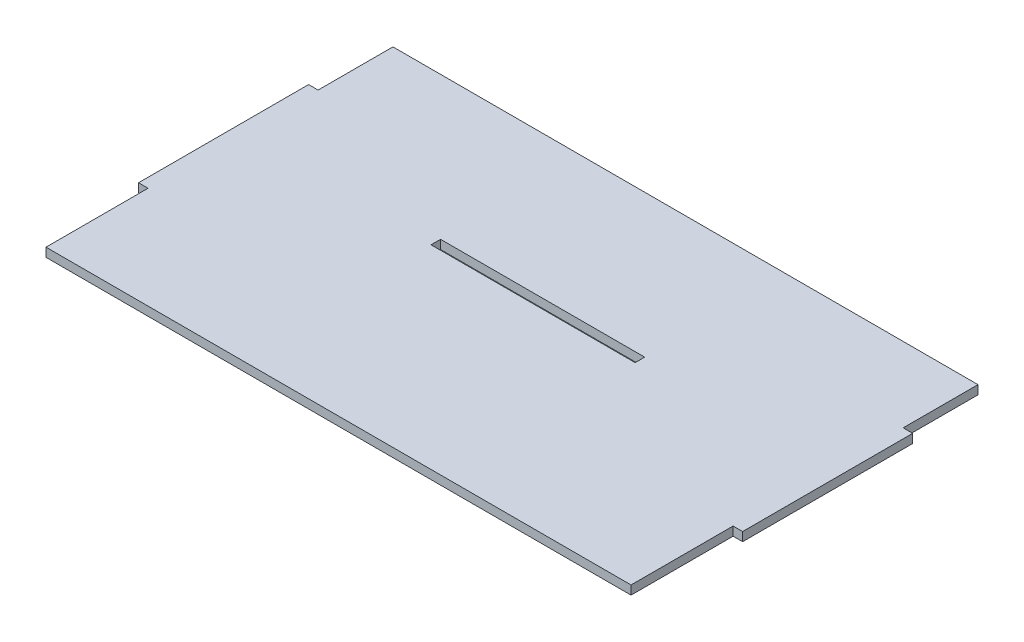
ISO-10303-21;
HEADER;
FILE_DESCRIPTION(('STEP AP214'),'2;1');
FILE_NAME('part.step','',(''),(''),'','','');
FILE_SCHEMA(('AUTOMOTIVE_DESIGN { 1 0 10303 214 1 1 1 1 }'));
ENDSEC;
DATA;
#1=APPLICATION_CONTEXT('core data for automotive mechanical design processes');
#2=APPLICATION_PROTOCOL_DEFINITION('international standard','automotive_design',2000,#1);
#3=PRODUCT_CONTEXT('',#1,'mechanical');
#4=PRODUCT('Part','Part','',(#3));
#5=PRODUCT_RELATED_PRODUCT_CATEGORY('part','',(#4));
#6=PRODUCT_DEFINITION_FORMATION('','',#4);
#7=PRODUCT_DEFINITION_CONTEXT('part definition',#1,'design');
#8=PRODUCT_DEFINITION('design','',#6,#7);
#9=PRODUCT_DEFINITION_SHAPE('','',#8);
#10=(LENGTH_UNIT() NAMED_UNIT(*) SI_UNIT(.MILLI.,.METRE.));
#11=(NAMED_UNIT(*) PLANE_ANGLE_UNIT() SI_UNIT($,.RADIAN.));
#12=(NAMED_UNIT(*) SI_UNIT($,.STERADIAN.) SOLID_ANGLE_UNIT());
#13=UNCERTAINTY_MEASURE_WITH_UNIT(LENGTH_MEASURE(1.E-05),#10,'distance_accuracy_value','');
#14=(GEOMETRIC_REPRESENTATION_CONTEXT(3) GLOBAL_UNCERTAINTY_ASSIGNED_CONTEXT((#13)) GLOBAL_UNIT_ASSIGNED_CONTEXT((#10,
#11,#12)) REPRESENTATION_CONTEXT('',''));
#15=CARTESIAN_POINT('',(0.,0.,0.));
#16=DIRECTION('',(0.,0.,1.));
#17=DIRECTION('',(1.,0.,0.));
#18=AXIS2_PLACEMENT_3D('',#15,#16,#17);
#19=CARTESIAN_POINT('',(43.,1.3,-25.));
#20=DIRECTION('',(-1.,0.,0.));
#21=DIRECTION('',(0.,0.,1.));
#22=AXIS2_PLACEMENT_3D('',#19,#20,#21);
#23=PLANE('',#22);
#24=DIRECTION('',(0.,1.,0.));
#25=VECTOR('',#24,1.);
#26=CARTESIAN_POINT('',(43.,0.,-15.));
#27=LINE('',#26,#25);
#28=CARTESIAN_POINT('',(43.,0.,-15.));
#29=VERTEX_POINT('',#28);
#30=CARTESIAN_POINT('',(43.,1.3,-15.));
#31=VERTEX_POINT('',#30);
#32=EDGE_CURVE('E227',#29,#31,#27,.T.);
#33=ORIENTED_EDGE('',*,*,#32,.F.);
#34=DIRECTION('',(0.,0.,-1.));
#35=VECTOR('',#34,1.);
#36=CARTESIAN_POINT('',(43.,0.,-25.));
#37=LINE('',#36,#35);
#38=CARTESIAN_POINT('',(43.,0.,-26.));
#39=VERTEX_POINT('',#38);
#40=EDGE_CURVE('E178',#29,#39,#37,.T.);
#41=ORIENTED_EDGE('',*,*,#40,.T.);
#42=DIRECTION('',(0.,-1.,0.));
#43=VECTOR('',#42,1.);
#44=CARTESIAN_POINT('',(43.,1.3,-26.));
#45=LINE('',#44,#43);
#46=CARTESIAN_POINT('',(43.,1.3,-26.));
#47=VERTEX_POINT('',#46);
#48=EDGE_CURVE('E176',#47,#39,#45,.T.);
#49=ORIENTED_EDGE('',*,*,#48,.F.);
#50=DIRECTION('',(0.,0.,-1.));
#51=VECTOR('',#50,1.);
#52=CARTESIAN_POINT('',(43.,1.3,-25.));
#53=LINE('',#52,#51);
#54=EDGE_CURVE('E158',#31,#47,#53,.T.);
#55=ORIENTED_EDGE('',*,*,#54,.F.);
#56=EDGE_LOOP('',(#33,#41,#49,#55));
#57=FACE_BOUND('',#56,.T.);
#58=ADVANCED_FACE('F43',(#57),#23,.F.);
#59=CARTESIAN_POINT('',(-43.,1.3,-25.));
#60=DIRECTION('',(1.,0.,0.));
#61=DIRECTION('',(0.,0.,-1.));
#62=AXIS2_PLACEMENT_3D('',#59,#60,#61);
#63=PLANE('',#62);
#64=DIRECTION('',(0.,1.,0.));
#65=VECTOR('',#64,1.);
#66=CARTESIAN_POINT('',(-43.,0.,9.99999999999999));
#67=LINE('',#66,#65);
#68=CARTESIAN_POINT('',(-43.,0.,9.99999999999999));
#69=VERTEX_POINT('',#68);
#70=CARTESIAN_POINT('',(-43.,1.3,9.99999999999999));
#71=VERTEX_POINT('',#70);
#72=EDGE_CURVE('E292',#69,#71,#67,.T.);
#73=ORIENTED_EDGE('',*,*,#72,.F.);
#74=DIRECTION('',(0.,0.,1.));
#75=VECTOR('',#74,1.);
#76=CARTESIAN_POINT('',(-43.,0.,-25.));
#77=LINE('',#76,#75);
#78=CARTESIAN_POINT('',(-43.,0.,25.));
#79=VERTEX_POINT('',#78);
#80=EDGE_CURVE('E316',#69,#79,#77,.T.);
#81=ORIENTED_EDGE('',*,*,#80,.T.);
#82=DIRECTION('',(0.,-1.,0.));
#83=VECTOR('',#82,1.);
#84=CARTESIAN_POINT('',(-43.,1.3,25.));
#85=LINE('',#84,#83);
#86=CARTESIAN_POINT('',(-43.,1.3,25.));
#87=VERTEX_POINT('',#86);
#88=EDGE_CURVE('E11',#87,#79,#85,.T.);
#89=ORIENTED_EDGE('',*,*,#88,.F.);
#90=DIRECTION('',(0.,0.,1.));
#91=VECTOR('',#90,1.);
#92=CARTESIAN_POINT('',(-43.,1.3,-25.));
#93=LINE('',#92,#91);
#94=EDGE_CURVE('E305',#71,#87,#93,.T.);
#95=ORIENTED_EDGE('',*,*,#94,.F.);
#96=EDGE_LOOP('',(#73,#81,#89,#95));
#97=FACE_BOUND('',#96,.T.);
#98=ADVANCED_FACE('F345',(#97),#63,.F.);
#99=CARTESIAN_POINT('',(43.,0.,25.));
#100=VERTEX_POINT('',#99);
#101=CARTESIAN_POINT('',(43.,0.,9.99999999999999));
#102=VERTEX_POINT('',#101);
#103=EDGE_CURVE('E312',#100,#102,#37,.T.);
#104=ORIENTED_EDGE('',*,*,#103,.T.);
#105=DIRECTION('',(0.,1.,0.));
#106=VECTOR('',#105,1.);
#107=CARTESIAN_POINT('',(43.,0.,9.99999999999999));
#108=LINE('',#107,#106);
#109=CARTESIAN_POINT('',(43.,1.3,9.99999999999998));
#110=VERTEX_POINT('',#109);
#111=EDGE_CURVE('E236',#102,#110,#108,.T.);
#112=ORIENTED_EDGE('',*,*,#111,.T.);
#113=CARTESIAN_POINT('',(43.,1.3,25.));
#114=VERTEX_POINT('',#113);
#115=EDGE_CURVE('E172',#114,#110,#53,.T.);
#116=ORIENTED_EDGE('',*,*,#115,.F.);
#117=DIRECTION('',(0.,-1.,0.));
#118=VECTOR('',#117,1.);
#119=CARTESIAN_POINT('',(43.,1.3,25.));
#120=LINE('',#119,#118);
#121=EDGE_CURVE('E52',#114,#100,#120,.T.);
#122=ORIENTED_EDGE('',*,*,#121,.T.);
#123=EDGE_LOOP('',(#104,#112,#116,#122));
#124=FACE_BOUND('',#123,.T.);
#125=ADVANCED_FACE('F45',(#124),#23,.F.);
#126=CARTESIAN_POINT('',(-43.,0.,-26.));
#127=VERTEX_POINT('',#126);
#128=CARTESIAN_POINT('',(-43.,0.,-15.));
#129=VERTEX_POINT('',#128);
#130=EDGE_CURVE('E317',#127,#129,#77,.T.);
#131=ORIENTED_EDGE('',*,*,#130,.T.);
#132=DIRECTION('',(0.,1.,0.));
#133=VECTOR('',#132,1.);
#134=CARTESIAN_POINT('',(-43.,0.,-15.));
#135=LINE('',#134,#133);
#136=CARTESIAN_POINT('',(-43.,1.3,-15.));
#137=VERTEX_POINT('',#136);
#138=EDGE_CURVE('E281',#129,#137,#135,.T.);
#139=ORIENTED_EDGE('',*,*,#138,.T.);
#140=CARTESIAN_POINT('',(-43.,1.3,-26.));
#141=VERTEX_POINT('',#140);
#142=EDGE_CURVE('E306',#141,#137,#93,.T.);
#143=ORIENTED_EDGE('',*,*,#142,.F.);
#144=DIRECTION('',(0.,-1.,0.));
#145=VECTOR('',#144,1.);
#146=CARTESIAN_POINT('',(-43.,1.3,-26.));
#147=LINE('',#146,#145);
#148=EDGE_CURVE('E183',#141,#127,#147,.T.);
#149=ORIENTED_EDGE('',*,*,#148,.T.);
#150=EDGE_LOOP('',(#131,#139,#143,#149));
#151=FACE_BOUND('',#150,.T.);
#152=ADVANCED_FACE('F361',(#151),#63,.F.);
#153=CARTESIAN_POINT('',(-43.,1.3,25.));
#154=DIRECTION('',(0.,0.,-1.));
#155=DIRECTION('',(-1.,0.,0.));
#156=AXIS2_PLACEMENT_3D('',#153,#154,#155);
#157=PLANE('',#156);
#158=DIRECTION('',(1.,0.,0.));
#159=VECTOR('',#158,1.);
#160=CARTESIAN_POINT('',(-43.,0.,25.));
#161=LINE('',#160,#159);
#162=EDGE_CURVE('E173',#79,#100,#161,.T.);
#163=ORIENTED_EDGE('',*,*,#162,.T.);
#164=ORIENTED_EDGE('',*,*,#121,.F.);
#165=DIRECTION('',(1.,0.,0.));
#166=VECTOR('',#165,1.);
#167=CARTESIAN_POINT('',(-43.,1.3,25.));
#168=LINE('',#167,#166);
#169=EDGE_CURVE('E309',#87,#114,#168,.T.);
#170=ORIENTED_EDGE('',*,*,#169,.F.);
#171=ORIENTED_EDGE('',*,*,#88,.T.);
#172=EDGE_LOOP('',(#163,#164,#170,#171));
#173=FACE_BOUND('',#172,.T.);
#174=ADVANCED_FACE('F342',(#173),#157,.F.);
#175=CARTESIAN_POINT('',(0.,1.3,0.));
#176=DIRECTION('',(0.,1.,0.));
#177=DIRECTION('',(0.,0.,1.));
#178=AXIS2_PLACEMENT_3D('',#175,#176,#177);
#179=PLANE('',#178);
#180=DIRECTION('',(0.,0.,-1.));
#181=VECTOR('',#180,1.);
#182=CARTESIAN_POINT('',(15.,1.3,-5.00000000000001));
#183=LINE('',#182,#181);
#184=CARTESIAN_POINT('',(15.,1.3,-3.60000000000001));
#185=VERTEX_POINT('',#184);
#186=CARTESIAN_POINT('',(15.,1.3,-5.00000000000001));
#187=VERTEX_POINT('',#186);
#188=EDGE_CURVE('E59',#185,#187,#183,.T.);
#189=ORIENTED_EDGE('',*,*,#188,.F.);
#190=DIRECTION('',(1.,0.,0.));
#191=VECTOR('',#190,1.);
#192=CARTESIAN_POINT('',(-15.,1.3,-3.60000000000001));
#193=LINE('',#192,#191);
#194=CARTESIAN_POINT('',(-15.,1.3,-3.60000000000001));
#195=VERTEX_POINT('',#194);
#196=EDGE_CURVE('E200',#195,#185,#193,.T.);
#197=ORIENTED_EDGE('',*,*,#196,.F.);
#198=DIRECTION('',(0.,0.,1.));
#199=VECTOR('',#198,1.);
#200=CARTESIAN_POINT('',(-15.,1.3,-5.00000000000001));
#201=LINE('',#200,#199);
#202=CARTESIAN_POINT('',(-15.,1.3,-5.00000000000001));
#203=VERTEX_POINT('',#202);
#204=EDGE_CURVE('E217',#203,#195,#201,.T.);
#205=ORIENTED_EDGE('',*,*,#204,.F.);
#206=DIRECTION('',(-1.,0.,0.));
#207=VECTOR('',#206,1.);
#208=CARTESIAN_POINT('',(-15.,1.3,-5.00000000000001));
#209=LINE('',#208,#207);
#210=EDGE_CURVE('E213',#187,#203,#209,.T.);
#211=ORIENTED_EDGE('',*,*,#210,.F.);
#212=EDGE_LOOP('',(#189,#197,#205,#211));
#213=FACE_BOUND('',#212,.T.);
#214=ORIENTED_EDGE('',*,*,#115,.T.);
#215=DIRECTION('',(1.,0.,0.));
#216=VECTOR('',#215,1.);
#217=CARTESIAN_POINT('',(43.,1.3,9.99999999999999));
#218=LINE('',#217,#216);
#219=CARTESIAN_POINT('',(44.4,1.3,9.99999999999999));
#220=VERTEX_POINT('',#219);
#221=EDGE_CURVE('E255',#110,#220,#218,.T.);
#222=ORIENTED_EDGE('',*,*,#221,.T.);
#223=DIRECTION('',(0.,0.,-1.));
#224=VECTOR('',#223,1.);
#225=CARTESIAN_POINT('',(44.4,1.3,-15.));
#226=LINE('',#225,#224);
#227=CARTESIAN_POINT('',(44.4,1.3,-15.));
#228=VERTEX_POINT('',#227);
#229=EDGE_CURVE('E251',#220,#228,#226,.T.);
#230=ORIENTED_EDGE('',*,*,#229,.T.);
#231=DIRECTION('',(-1.,0.,0.));
#232=VECTOR('',#231,1.);
#233=CARTESIAN_POINT('',(43.,1.3,-15.));
#234=LINE('',#233,#232);
#235=EDGE_CURVE('E168',#228,#31,#234,.T.);
#236=ORIENTED_EDGE('',*,*,#235,.T.);
#237=ORIENTED_EDGE('',*,*,#54,.T.);
#238=DIRECTION('',(-1.,0.,0.));
#239=VECTOR('',#238,1.);
#240=CARTESIAN_POINT('',(-43.,1.3,-26.));
#241=LINE('',#240,#239);
#242=EDGE_CURVE('E164',#47,#141,#241,.T.);
#243=ORIENTED_EDGE('',*,*,#242,.T.);
#244=ORIENTED_EDGE('',*,*,#142,.T.);
#245=DIRECTION('',(-1.,0.,0.));
#246=VECTOR('',#245,1.);
#247=CARTESIAN_POINT('',(-43.,1.3,-15.));
#248=LINE('',#247,#246);
#249=CARTESIAN_POINT('',(-44.4,1.3,-15.));
#250=VERTEX_POINT('',#249);
#251=EDGE_CURVE('E259',#137,#250,#248,.T.);
#252=ORIENTED_EDGE('',*,*,#251,.T.);
#253=DIRECTION('',(0.,0.,1.));
#254=VECTOR('',#253,1.);
#255=CARTESIAN_POINT('',(-44.4,1.3,-15.));
#256=LINE('',#255,#254);
#257=CARTESIAN_POINT('',(-44.4,1.3,9.99999999999999));
#258=VERTEX_POINT('',#257);
#259=EDGE_CURVE('E285',#250,#258,#256,.T.);
#260=ORIENTED_EDGE('',*,*,#259,.T.);
#261=DIRECTION('',(1.,0.,0.));
#262=VECTOR('',#261,1.);
#263=CARTESIAN_POINT('',(-43.,1.3,9.99999999999999));
#264=LINE('',#263,#262);
#265=EDGE_CURVE('E274',#258,#71,#264,.T.);
#266=ORIENTED_EDGE('',*,*,#265,.T.);
#267=ORIENTED_EDGE('',*,*,#94,.T.);
#268=ORIENTED_EDGE('',*,*,#169,.T.);
#269=EDGE_LOOP('',(#214,#222,#230,#236,#237,#243,#244,#252,#260,#266,#267,#268));
#270=FACE_BOUND('',#269,.T.);
#271=ADVANCED_FACE('F161',(#213,#270),#179,.T.);
#272=CARTESIAN_POINT('',(0.,0.,0.));
#273=DIRECTION('',(0.,1.,0.));
#274=DIRECTION('',(0.,0.,1.));
#275=AXIS2_PLACEMENT_3D('',#272,#273,#274);
#276=PLANE('',#275);
#277=DIRECTION('',(1.,0.,0.));
#278=VECTOR('',#277,1.);
#279=CARTESIAN_POINT('',(-15.,0.,-3.60000000000001));
#280=LINE('',#279,#278);
#281=CARTESIAN_POINT('',(-15.,0.,-3.60000000000001));
#282=VERTEX_POINT('',#281);
#283=CARTESIAN_POINT('',(15.,0.,-3.60000000000001));
#284=VERTEX_POINT('',#283);
#285=EDGE_CURVE('E206',#282,#284,#280,.T.);
#286=ORIENTED_EDGE('',*,*,#285,.T.);
#287=DIRECTION('',(0.,0.,-1.));
#288=VECTOR('',#287,1.);
#289=CARTESIAN_POINT('',(15.,0.,-5.00000000000001));
#290=LINE('',#289,#288);
#291=CARTESIAN_POINT('',(15.,0.,-5.00000000000001));
#292=VERTEX_POINT('',#291);
#293=EDGE_CURVE('E195',#284,#292,#290,.T.);
#294=ORIENTED_EDGE('',*,*,#293,.T.);
#295=DIRECTION('',(-1.,0.,0.));
#296=VECTOR('',#295,1.);
#297=CARTESIAN_POINT('',(-15.,0.,-5.00000000000001));
#298=LINE('',#297,#296);
#299=CARTESIAN_POINT('',(-15.,0.,-5.00000000000001));
#300=VERTEX_POINT('',#299);
#301=EDGE_CURVE('E199',#292,#300,#298,.T.);
#302=ORIENTED_EDGE('',*,*,#301,.T.);
#303=DIRECTION('',(0.,0.,1.));
#304=VECTOR('',#303,1.);
#305=CARTESIAN_POINT('',(-15.,0.,-5.00000000000001));
#306=LINE('',#305,#304);
#307=EDGE_CURVE('E67',#300,#282,#306,.T.);
#308=ORIENTED_EDGE('',*,*,#307,.T.);
#309=EDGE_LOOP('',(#286,#294,#302,#308));
#310=FACE_BOUND('',#309,.T.);
#311=ORIENTED_EDGE('',*,*,#103,.F.);
#312=ORIENTED_EDGE('',*,*,#162,.F.);
#313=ORIENTED_EDGE('',*,*,#80,.F.);
#314=DIRECTION('',(1.,0.,0.));
#315=VECTOR('',#314,1.);
#316=CARTESIAN_POINT('',(-43.,0.,9.99999999999999));
#317=LINE('',#316,#315);
#318=CARTESIAN_POINT('',(-44.4,0.,9.99999999999999));
#319=VERTEX_POINT('',#318);
#320=EDGE_CURVE('E278',#319,#69,#317,.T.);
#321=ORIENTED_EDGE('',*,*,#320,.F.);
#322=DIRECTION('',(0.,0.,1.));
#323=VECTOR('',#322,1.);
#324=CARTESIAN_POINT('',(-44.4,0.,-15.));
#325=LINE('',#324,#323);
#326=CARTESIAN_POINT('',(-44.4,0.,-15.));
#327=VERTEX_POINT('',#326);
#328=EDGE_CURVE('E273',#327,#319,#325,.T.);
#329=ORIENTED_EDGE('',*,*,#328,.F.);
#330=DIRECTION('',(-1.,0.,0.));
#331=VECTOR('',#330,1.);
#332=CARTESIAN_POINT('',(-43.,0.,-15.));
#333=LINE('',#332,#331);
#334=EDGE_CURVE('E269',#129,#327,#333,.T.);
#335=ORIENTED_EDGE('',*,*,#334,.F.);
#336=ORIENTED_EDGE('',*,*,#130,.F.);
#337=DIRECTION('',(-1.,0.,0.));
#338=VECTOR('',#337,1.);
#339=CARTESIAN_POINT('',(-43.,0.,-26.));
#340=LINE('',#339,#338);
#341=EDGE_CURVE('E188',#39,#127,#340,.T.);
#342=ORIENTED_EDGE('',*,*,#341,.F.);
#343=ORIENTED_EDGE('',*,*,#40,.F.);
#344=DIRECTION('',(-1.,0.,0.));
#345=VECTOR('',#344,1.);
#346=CARTESIAN_POINT('',(43.,0.,-15.));
#347=LINE('',#346,#345);
#348=CARTESIAN_POINT('',(44.4,0.,-15.));
#349=VERTEX_POINT('',#348);
#350=EDGE_CURVE('E240',#349,#29,#347,.T.);
#351=ORIENTED_EDGE('',*,*,#350,.F.);
#352=DIRECTION('',(0.,0.,-1.));
#353=VECTOR('',#352,1.);
#354=CARTESIAN_POINT('',(44.4,0.,-15.));
#355=LINE('',#354,#353);
#356=CARTESIAN_POINT('',(44.4,0.,9.99999999999999));
#357=VERTEX_POINT('',#356);
#358=EDGE_CURVE('E262',#357,#349,#355,.T.);
#359=ORIENTED_EDGE('',*,*,#358,.F.);
#360=DIRECTION('',(1.,0.,0.));
#361=VECTOR('',#360,1.);
#362=CARTESIAN_POINT('',(43.,0.,9.99999999999999));
#363=LINE('',#362,#361);
#364=EDGE_CURVE('E252',#102,#357,#363,.T.);
#365=ORIENTED_EDGE('',*,*,#364,.F.);
#366=EDGE_LOOP('',(#311,#312,#313,#321,#329,#335,#336,#342,#343,#351,#359,#365));
#367=FACE_BOUND('',#366,.T.);
#368=ADVANCED_FACE('F333',(#310,#367),#276,.F.);
#369=CARTESIAN_POINT('',(-43.,0.,9.99999999999999));
#370=DIRECTION('',(0.,0.,1.));
#371=DIRECTION('',(1.,0.,0.));
#372=AXIS2_PLACEMENT_3D('',#369,#370,#371);
#373=PLANE('',#372);
#374=ORIENTED_EDGE('',*,*,#265,.F.);
#375=DIRECTION('',(0.,1.,0.));
#376=VECTOR('',#375,1.);
#377=CARTESIAN_POINT('',(-44.4,0.,9.99999999999999));
#378=LINE('',#377,#376);
#379=EDGE_CURVE('E295',#319,#258,#378,.T.);
#380=ORIENTED_EDGE('',*,*,#379,.F.);
#381=ORIENTED_EDGE('',*,*,#320,.T.);
#382=ORIENTED_EDGE('',*,*,#72,.T.);
#383=EDGE_LOOP('',(#374,#380,#381,#382));
#384=FACE_BOUND('',#383,.T.);
#385=ADVANCED_FACE('F354',(#384),#373,.T.);
#386=CARTESIAN_POINT('',(-44.4,0.,-15.));
#387=DIRECTION('',(-1.,0.,0.));
#388=DIRECTION('',(0.,0.,1.));
#389=AXIS2_PLACEMENT_3D('',#386,#387,#388);
#390=PLANE('',#389);
#391=ORIENTED_EDGE('',*,*,#259,.F.);
#392=DIRECTION('',(0.,1.,0.));
#393=VECTOR('',#392,1.);
#394=CARTESIAN_POINT('',(-44.4,0.,-15.));
#395=LINE('',#394,#393);
#396=EDGE_CURVE('E298',#327,#250,#395,.T.);
#397=ORIENTED_EDGE('',*,*,#396,.F.);
#398=ORIENTED_EDGE('',*,*,#328,.T.);
#399=ORIENTED_EDGE('',*,*,#379,.T.);
#400=EDGE_LOOP('',(#391,#397,#398,#399));
#401=FACE_BOUND('',#400,.T.);
#402=ADVANCED_FACE('F357',(#401),#390,.T.);
#403=CARTESIAN_POINT('',(-43.,0.,-15.));
#404=DIRECTION('',(0.,0.,-1.));
#405=DIRECTION('',(-1.,0.,0.));
#406=AXIS2_PLACEMENT_3D('',#403,#404,#405);
#407=PLANE('',#406);
#408=ORIENTED_EDGE('',*,*,#251,.F.);
#409=ORIENTED_EDGE('',*,*,#138,.F.);
#410=ORIENTED_EDGE('',*,*,#334,.T.);
#411=ORIENTED_EDGE('',*,*,#396,.T.);
#412=EDGE_LOOP('',(#408,#409,#410,#411));
#413=FACE_BOUND('',#412,.T.);
#414=ADVANCED_FACE('F359',(#413),#407,.T.);
#415=CARTESIAN_POINT('',(43.,0.,-15.));
#416=DIRECTION('',(0.,0.,-1.));
#417=DIRECTION('',(-1.,0.,0.));
#418=AXIS2_PLACEMENT_3D('',#415,#416,#417);
#419=PLANE('',#418);
#420=ORIENTED_EDGE('',*,*,#235,.F.);
#421=DIRECTION('',(0.,1.,0.));
#422=VECTOR('',#421,1.);
#423=CARTESIAN_POINT('',(44.4,0.,-15.));
#424=LINE('',#423,#422);
#425=EDGE_CURVE('E244',#349,#228,#424,.T.);
#426=ORIENTED_EDGE('',*,*,#425,.F.);
#427=ORIENTED_EDGE('',*,*,#350,.T.);
#428=ORIENTED_EDGE('',*,*,#32,.T.);
#429=EDGE_LOOP('',(#420,#426,#427,#428));
#430=FACE_BOUND('',#429,.T.);
#431=ADVANCED_FACE('F416',(#430),#419,.T.);
#432=CARTESIAN_POINT('',(44.4,0.,-15.));
#433=DIRECTION('',(1.,0.,0.));
#434=DIRECTION('',(0.,0.,-1.));
#435=AXIS2_PLACEMENT_3D('',#432,#433,#434);
#436=PLANE('',#435);
#437=ORIENTED_EDGE('',*,*,#229,.F.);
#438=DIRECTION('',(0.,1.,0.));
#439=VECTOR('',#438,1.);
#440=CARTESIAN_POINT('',(44.4,0.,9.99999999999999));
#441=LINE('',#440,#439);
#442=EDGE_CURVE('E241',#357,#220,#441,.T.);
#443=ORIENTED_EDGE('',*,*,#442,.F.);
#444=ORIENTED_EDGE('',*,*,#358,.T.);
#445=ORIENTED_EDGE('',*,*,#425,.T.);
#446=EDGE_LOOP('',(#437,#443,#444,#445));
#447=FACE_BOUND('',#446,.T.);
#448=ADVANCED_FACE('F409',(#447),#436,.T.);
#449=CARTESIAN_POINT('',(43.,0.,9.99999999999999));
#450=DIRECTION('',(0.,0.,1.));
#451=DIRECTION('',(1.,0.,0.));
#452=AXIS2_PLACEMENT_3D('',#449,#450,#451);
#453=PLANE('',#452);
#454=ORIENTED_EDGE('',*,*,#221,.F.);
#455=ORIENTED_EDGE('',*,*,#111,.F.);
#456=ORIENTED_EDGE('',*,*,#364,.T.);
#457=ORIENTED_EDGE('',*,*,#442,.T.);
#458=EDGE_LOOP('',(#454,#455,#456,#457));
#459=FACE_BOUND('',#458,.T.);
#460=ADVANCED_FACE('F338',(#459),#453,.T.);
#461=CARTESIAN_POINT('',(15.,0.,-5.00000000000001));
#462=DIRECTION('',(1.,0.,0.));
#463=DIRECTION('',(0.,0.,-1.));
#464=AXIS2_PLACEMENT_3D('',#461,#462,#463);
#465=PLANE('',#464);
#466=ORIENTED_EDGE('',*,*,#188,.T.);
#467=DIRECTION('',(0.,1.,0.));
#468=VECTOR('',#467,1.);
#469=CARTESIAN_POINT('',(15.,0.,-5.00000000000001));
#470=LINE('',#469,#468);
#471=EDGE_CURVE('E210',#292,#187,#470,.T.);
#472=ORIENTED_EDGE('',*,*,#471,.F.);
#473=ORIENTED_EDGE('',*,*,#293,.F.);
#474=DIRECTION('',(0.,1.,0.));
#475=VECTOR('',#474,1.);
#476=CARTESIAN_POINT('',(15.,0.,-3.60000000000001));
#477=LINE('',#476,#475);
#478=EDGE_CURVE('E224',#284,#185,#477,.T.);
#479=ORIENTED_EDGE('',*,*,#478,.T.);
#480=EDGE_LOOP('',(#466,#472,#473,#479));
#481=FACE_BOUND('',#480,.T.);
#482=ADVANCED_FACE('F395',(#481),#465,.F.);
#483=CARTESIAN_POINT('',(-15.,0.,-3.60000000000001));
#484=DIRECTION('',(0.,0.,1.));
#485=DIRECTION('',(1.,0.,0.));
#486=AXIS2_PLACEMENT_3D('',#483,#484,#485);
#487=PLANE('',#486);
#488=ORIENTED_EDGE('',*,*,#196,.T.);
#489=ORIENTED_EDGE('',*,*,#478,.F.);
#490=ORIENTED_EDGE('',*,*,#285,.F.);
#491=DIRECTION('',(0.,1.,0.));
#492=VECTOR('',#491,1.);
#493=CARTESIAN_POINT('',(-15.,0.,-3.60000000000001));
#494=LINE('',#493,#492);
#495=EDGE_CURVE('E228',#282,#195,#494,.T.);
#496=ORIENTED_EDGE('',*,*,#495,.T.);
#497=EDGE_LOOP('',(#488,#489,#490,#496));
#498=FACE_BOUND('',#497,.T.);
#499=ADVANCED_FACE('F388',(#498),#487,.F.);
#500=CARTESIAN_POINT('',(-15.,0.,-5.00000000000001));
#501=DIRECTION('',(-1.,0.,0.));
#502=DIRECTION('',(0.,0.,1.));
#503=AXIS2_PLACEMENT_3D('',#500,#501,#502);
#504=PLANE('',#503);
#505=ORIENTED_EDGE('',*,*,#204,.T.);
#506=ORIENTED_EDGE('',*,*,#495,.F.);
#507=ORIENTED_EDGE('',*,*,#307,.F.);
#508=DIRECTION('',(0.,1.,0.));
#509=VECTOR('',#508,1.);
#510=CARTESIAN_POINT('',(-15.,0.,-5.00000000000001));
#511=LINE('',#510,#509);
#512=EDGE_CURVE('E231',#300,#203,#511,.T.);
#513=ORIENTED_EDGE('',*,*,#512,.T.);
#514=EDGE_LOOP('',(#505,#506,#507,#513));
#515=FACE_BOUND('',#514,.T.);
#516=ADVANCED_FACE('F380',(#515),#504,.F.);
#517=CARTESIAN_POINT('',(-15.,0.,-5.00000000000001));
#518=DIRECTION('',(0.,0.,-1.));
#519=DIRECTION('',(-1.,0.,0.));
#520=AXIS2_PLACEMENT_3D('',#517,#518,#519);
#521=PLANE('',#520);
#522=ORIENTED_EDGE('',*,*,#210,.T.);
#523=ORIENTED_EDGE('',*,*,#512,.F.);
#524=ORIENTED_EDGE('',*,*,#301,.F.);
#525=ORIENTED_EDGE('',*,*,#471,.T.);
#526=EDGE_LOOP('',(#522,#523,#524,#525));
#527=FACE_BOUND('',#526,.T.);
#528=ADVANCED_FACE('F377',(#527),#521,.F.);
#529=CARTESIAN_POINT('',(-43.,1.3,-26.));
#530=DIRECTION('',(0.,0.,1.));
#531=DIRECTION('',(1.,0.,0.));
#532=AXIS2_PLACEMENT_3D('',#529,#530,#531);
#533=PLANE('',#532);
#534=ORIENTED_EDGE('',*,*,#341,.T.);
#535=ORIENTED_EDGE('',*,*,#148,.F.);
#536=ORIENTED_EDGE('',*,*,#242,.F.);
#537=ORIENTED_EDGE('',*,*,#48,.T.);
#538=EDGE_LOOP('',(#534,#535,#536,#537));
#539=FACE_BOUND('',#538,.T.);
#540=ADVANCED_FACE('F185',(#539),#533,.F.);
#541=CLOSED_SHELL('',(#58,#98,#125,#152,#174,#271,#368,#385,#402,#414,#431,#448,#460,#482,#499,
#516,#528,#540));
#542=MANIFOLD_SOLID_BREP('B2',#541);
#543=ADVANCED_BREP_SHAPE_REPRESENTATION('',(#18,#542),#14);
#544=SHAPE_DEFINITION_REPRESENTATION(#9,#543);
ENDSEC;
END-ISO-10303-21;
